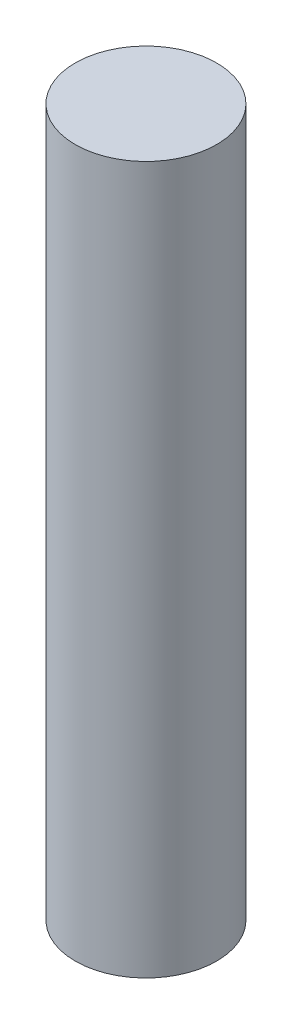
ISO-10303-21;
HEADER;
FILE_DESCRIPTION(('STEP AP214'),'2;1');
FILE_NAME('part.step','',(''),(''),'','','');
FILE_SCHEMA(('AUTOMOTIVE_DESIGN { 1 0 10303 214 1 1 1 1 }'));
ENDSEC;
DATA;
#1=APPLICATION_CONTEXT('core data for automotive mechanical design processes');
#2=APPLICATION_PROTOCOL_DEFINITION('international standard','automotive_design',2000,#1);
#3=PRODUCT_CONTEXT('',#1,'mechanical');
#4=PRODUCT('Part','Part','',(#3));
#5=PRODUCT_RELATED_PRODUCT_CATEGORY('part','',(#4));
#6=PRODUCT_DEFINITION_FORMATION('','',#4);
#7=PRODUCT_DEFINITION_CONTEXT('part definition',#1,'design');
#8=PRODUCT_DEFINITION('design','',#6,#7);
#9=PRODUCT_DEFINITION_SHAPE('','',#8);
#10=(LENGTH_UNIT() NAMED_UNIT(*) SI_UNIT(.MILLI.,.METRE.));
#11=(NAMED_UNIT(*) PLANE_ANGLE_UNIT() SI_UNIT($,.RADIAN.));
#12=(NAMED_UNIT(*) SI_UNIT($,.STERADIAN.) SOLID_ANGLE_UNIT());
#13=UNCERTAINTY_MEASURE_WITH_UNIT(LENGTH_MEASURE(1.E-05),#10,'distance_accuracy_value','');
#14=(GEOMETRIC_REPRESENTATION_CONTEXT(3) GLOBAL_UNCERTAINTY_ASSIGNED_CONTEXT((#13)) GLOBAL_UNIT_ASSIGNED_CONTEXT((#10,
#11,#12)) REPRESENTATION_CONTEXT('',''));
#15=CARTESIAN_POINT('',(0.,0.,0.));
#16=DIRECTION('',(0.,0.,1.));
#17=DIRECTION('',(1.,0.,0.));
#18=AXIS2_PLACEMENT_3D('',#15,#16,#17);
#19=CARTESIAN_POINT('',(0.,10.,0.));
#20=DIRECTION('',(0.,-1.,0.));
#21=DIRECTION('',(0.,0.,-1.));
#22=AXIS2_PLACEMENT_3D('',#19,#20,#21);
#23=CYLINDRICAL_SURFACE('',#22,1.);
#24=CARTESIAN_POINT('',(0.,10.,0.));
#25=DIRECTION('',(0.,1.,0.));
#26=DIRECTION('',(0.,0.,1.));
#27=AXIS2_PLACEMENT_3D('',#24,#25,#26);
#28=CIRCLE('',#27,1.);
#29=CARTESIAN_POINT('',(0.,10.,1.));
#30=VERTEX_POINT('',#29);
#31=EDGE_CURVE('E10',#30,#30,#28,.T.);
#32=ORIENTED_EDGE('',*,*,#31,.F.);
#33=EDGE_LOOP('',(#32));
#34=FACE_BOUND('',#33,.T.);
#35=CARTESIAN_POINT('',(0.,0.,0.));
#36=DIRECTION('',(0.,1.,0.));
#37=DIRECTION('',(0.,0.,1.));
#38=AXIS2_PLACEMENT_3D('',#35,#36,#37);
#39=CIRCLE('',#38,1.);
#40=CARTESIAN_POINT('',(0.,0.,1.));
#41=VERTEX_POINT('',#40);
#42=EDGE_CURVE('E34',#41,#41,#39,.T.);
#43=ORIENTED_EDGE('',*,*,#42,.T.);
#44=EDGE_LOOP('',(#43));
#45=FACE_BOUND('',#44,.T.);
#46=ADVANCED_FACE('F31',(#34,#45),#23,.T.);
#47=CARTESIAN_POINT('',(0.,10.,0.));
#48=DIRECTION('',(0.,1.,0.));
#49=DIRECTION('',(0.,0.,1.));
#50=AXIS2_PLACEMENT_3D('',#47,#48,#49);
#51=PLANE('',#50);
#52=ORIENTED_EDGE('',*,*,#31,.T.);
#53=EDGE_LOOP('',(#52));
#54=FACE_BOUND('',#53,.T.);
#55=ADVANCED_FACE('F46',(#54),#51,.T.);
#56=CARTESIAN_POINT('',(0.,0.,0.));
#57=DIRECTION('',(0.,1.,0.));
#58=DIRECTION('',(0.,0.,1.));
#59=AXIS2_PLACEMENT_3D('',#56,#57,#58);
#60=PLANE('',#59);
#61=ORIENTED_EDGE('',*,*,#42,.F.);
#62=EDGE_LOOP('',(#61));
#63=FACE_BOUND('',#62,.T.);
#64=ADVANCED_FACE('F44',(#63),#60,.F.);
#65=CLOSED_SHELL('',(#46,#55,#64));
#66=MANIFOLD_SOLID_BREP('B2',#65);
#67=ADVANCED_BREP_SHAPE_REPRESENTATION('',(#18,#66),#14);
#68=SHAPE_DEFINITION_REPRESENTATION(#9,#67);
ENDSEC;
END-ISO-10303-21;
